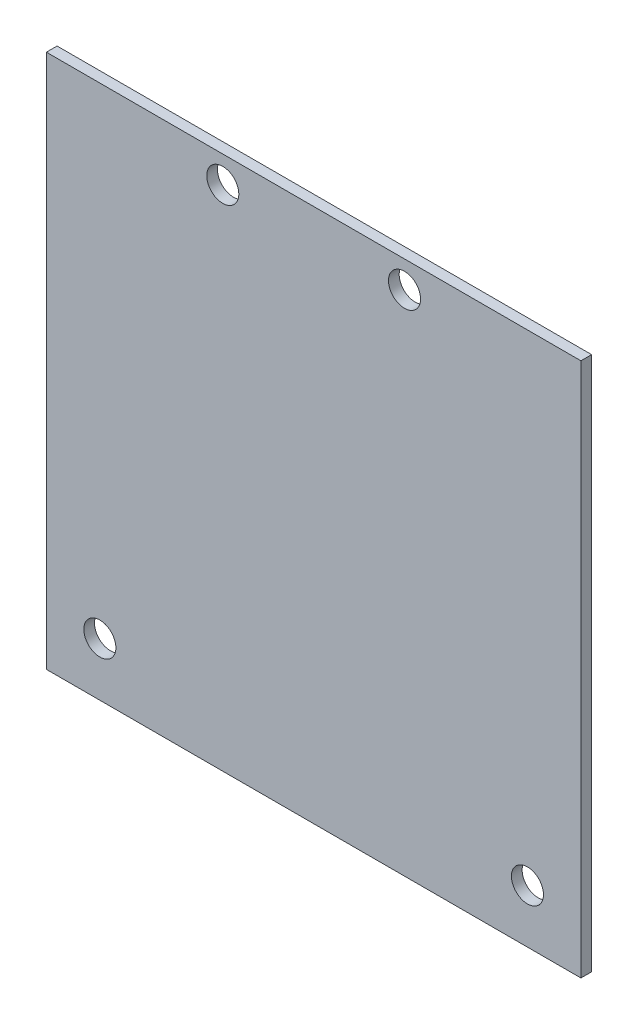
ISO-10303-21;
HEADER;
FILE_DESCRIPTION(('STEP AP214'),'2;1');
FILE_NAME('part.step','',(''),(''),'','','');
FILE_SCHEMA(('AUTOMOTIVE_DESIGN { 1 0 10303 214 1 1 1 1 }'));
ENDSEC;
DATA;
#1=APPLICATION_CONTEXT('core data for automotive mechanical design processes');
#2=APPLICATION_PROTOCOL_DEFINITION('international standard','automotive_design',2000,#1);
#3=PRODUCT_CONTEXT('',#1,'mechanical');
#4=PRODUCT('Part','Part','',(#3));
#5=PRODUCT_RELATED_PRODUCT_CATEGORY('part','',(#4));
#6=PRODUCT_DEFINITION_FORMATION('','',#4);
#7=PRODUCT_DEFINITION_CONTEXT('part definition',#1,'design');
#8=PRODUCT_DEFINITION('design','',#6,#7);
#9=PRODUCT_DEFINITION_SHAPE('','',#8);
#10=(LENGTH_UNIT() NAMED_UNIT(*) SI_UNIT(.MILLI.,.METRE.));
#11=(NAMED_UNIT(*) PLANE_ANGLE_UNIT() SI_UNIT($,.RADIAN.));
#12=(NAMED_UNIT(*) SI_UNIT($,.STERADIAN.) SOLID_ANGLE_UNIT());
#13=UNCERTAINTY_MEASURE_WITH_UNIT(LENGTH_MEASURE(1.E-05),#10,'distance_accuracy_value','');
#14=(GEOMETRIC_REPRESENTATION_CONTEXT(3) GLOBAL_UNCERTAINTY_ASSIGNED_CONTEXT((#13)) GLOBAL_UNIT_ASSIGNED_CONTEXT((#10,
#11,#12)) REPRESENTATION_CONTEXT('',''));
#15=CARTESIAN_POINT('',(0.,0.,0.));
#16=DIRECTION('',(0.,0.,1.));
#17=DIRECTION('',(1.,0.,0.));
#18=AXIS2_PLACEMENT_3D('',#15,#16,#17);
#19=CARTESIAN_POINT('',(0.,0.,1.));
#20=DIRECTION('',(0.,0.,-1.));
#21=DIRECTION('',(-1.,0.,0.));
#22=AXIS2_PLACEMENT_3D('',#19,#20,#21);
#23=PLANE('',#22);
#24=DIRECTION('',(0.,-1.,0.));
#25=VECTOR('',#24,1.);
#26=CARTESIAN_POINT('',(0.,0.,1.));
#27=LINE('',#26,#25);
#28=CARTESIAN_POINT('',(0.,50.,1.));
#29=VERTEX_POINT('',#28);
#30=CARTESIAN_POINT('',(0.,0.,1.));
#31=VERTEX_POINT('',#30);
#32=EDGE_CURVE('E84',#29,#31,#27,.T.);
#33=ORIENTED_EDGE('',*,*,#32,.T.);
#34=DIRECTION('',(1.,0.,0.));
#35=VECTOR('',#34,1.);
#36=CARTESIAN_POINT('',(0.,0.,1.));
#37=LINE('',#36,#35);
#38=CARTESIAN_POINT('',(50.,0.,1.));
#39=VERTEX_POINT('',#38);
#40=EDGE_CURVE('E79',#31,#39,#37,.T.);
#41=ORIENTED_EDGE('',*,*,#40,.T.);
#42=DIRECTION('',(0.,1.,0.));
#43=VECTOR('',#42,1.);
#44=CARTESIAN_POINT('',(50.,0.,1.));
#45=LINE('',#44,#43);
#46=CARTESIAN_POINT('',(50.,50.,1.));
#47=VERTEX_POINT('',#46);
#48=EDGE_CURVE('E82',#39,#47,#45,.T.);
#49=ORIENTED_EDGE('',*,*,#48,.T.);
#50=DIRECTION('',(-1.,0.,0.));
#51=VECTOR('',#50,1.);
#52=CARTESIAN_POINT('',(0.,50.,1.));
#53=LINE('',#52,#51);
#54=EDGE_CURVE('E49',#47,#29,#53,.T.);
#55=ORIENTED_EDGE('',*,*,#54,.T.);
#56=EDGE_LOOP('',(#33,#41,#49,#55));
#57=FACE_BOUND('',#56,.T.);
#58=CARTESIAN_POINT('',(16.5,47.5,1.));
#59=DIRECTION('',(0.,0.,1.));
#60=DIRECTION('',(1.,0.,0.));
#61=AXIS2_PLACEMENT_3D('',#58,#59,#60);
#62=CIRCLE('',#61,1.5);
#63=CARTESIAN_POINT('',(18.,47.5,1.));
#64=VERTEX_POINT('',#63);
#65=EDGE_CURVE('E99',#64,#64,#62,.T.);
#66=ORIENTED_EDGE('',*,*,#65,.F.);
#67=EDGE_LOOP('',(#66));
#68=FACE_BOUND('',#67,.T.);
#69=CARTESIAN_POINT('',(33.5,47.5,1.));
#70=DIRECTION('',(0.,0.,1.));
#71=DIRECTION('',(1.,0.,0.));
#72=AXIS2_PLACEMENT_3D('',#69,#70,#71);
#73=CIRCLE('',#72,1.5);
#74=CARTESIAN_POINT('',(35.,47.5,1.));
#75=VERTEX_POINT('',#74);
#76=EDGE_CURVE('E114',#75,#75,#73,.T.);
#77=ORIENTED_EDGE('',*,*,#76,.F.);
#78=EDGE_LOOP('',(#77));
#79=FACE_BOUND('',#78,.T.);
#80=CARTESIAN_POINT('',(5.,5.,1.));
#81=DIRECTION('',(0.,0.,1.));
#82=DIRECTION('',(1.,0.,0.));
#83=AXIS2_PLACEMENT_3D('',#80,#81,#82);
#84=CIRCLE('',#83,1.5);
#85=CARTESIAN_POINT('',(6.5,5.,1.));
#86=VERTEX_POINT('',#85);
#87=EDGE_CURVE('E120',#86,#86,#84,.T.);
#88=ORIENTED_EDGE('',*,*,#87,.F.);
#89=EDGE_LOOP('',(#88));
#90=FACE_BOUND('',#89,.T.);
#91=CARTESIAN_POINT('',(45.,5.,1.));
#92=DIRECTION('',(0.,0.,1.));
#93=DIRECTION('',(1.,0.,0.));
#94=AXIS2_PLACEMENT_3D('',#91,#92,#93);
#95=CIRCLE('',#94,1.5);
#96=CARTESIAN_POINT('',(46.5,5.,1.));
#97=VERTEX_POINT('',#96);
#98=EDGE_CURVE('E126',#97,#97,#95,.T.);
#99=ORIENTED_EDGE('',*,*,#98,.F.);
#100=EDGE_LOOP('',(#99));
#101=FACE_BOUND('',#100,.T.);
#102=ADVANCED_FACE('F32',(#57,#68,#79,#90,#101),#23,.F.);
#103=CARTESIAN_POINT('',(0.,0.,0.));
#104=DIRECTION('',(0.,0.,-1.));
#105=DIRECTION('',(-1.,0.,0.));
#106=AXIS2_PLACEMENT_3D('',#103,#104,#105);
#107=PLANE('',#106);
#108=CARTESIAN_POINT('',(5.,5.,0.));
#109=DIRECTION('',(0.,0.,1.));
#110=DIRECTION('',(1.,0.,0.));
#111=AXIS2_PLACEMENT_3D('',#108,#109,#110);
#112=CIRCLE('',#111,1.5);
#113=CARTESIAN_POINT('',(6.5,5.,0.));
#114=VERTEX_POINT('',#113);
#115=EDGE_CURVE('E123',#114,#114,#112,.T.);
#116=ORIENTED_EDGE('',*,*,#115,.T.);
#117=EDGE_LOOP('',(#116));
#118=FACE_BOUND('',#117,.T.);
#119=CARTESIAN_POINT('',(16.5,47.5,0.));
#120=DIRECTION('',(0.,0.,1.));
#121=DIRECTION('',(1.,0.,0.));
#122=AXIS2_PLACEMENT_3D('',#119,#120,#121);
#123=CIRCLE('',#122,1.5);
#124=CARTESIAN_POINT('',(18.,47.5,0.));
#125=VERTEX_POINT('',#124);
#126=EDGE_CURVE('E111',#125,#125,#123,.T.);
#127=ORIENTED_EDGE('',*,*,#126,.T.);
#128=EDGE_LOOP('',(#127));
#129=FACE_BOUND('',#128,.T.);
#130=DIRECTION('',(0.,-1.,0.));
#131=VECTOR('',#130,1.);
#132=CARTESIAN_POINT('',(0.,0.,0.));
#133=LINE('',#132,#131);
#134=CARTESIAN_POINT('',(0.,50.,0.));
#135=VERTEX_POINT('',#134);
#136=CARTESIAN_POINT('',(0.,0.,0.));
#137=VERTEX_POINT('',#136);
#138=EDGE_CURVE('E96',#135,#137,#133,.T.);
#139=ORIENTED_EDGE('',*,*,#138,.F.);
#140=DIRECTION('',(-1.,0.,0.));
#141=VECTOR('',#140,1.);
#142=CARTESIAN_POINT('',(0.,50.,0.));
#143=LINE('',#142,#141);
#144=CARTESIAN_POINT('',(50.,50.,0.));
#145=VERTEX_POINT('',#144);
#146=EDGE_CURVE('E72',#145,#135,#143,.T.);
#147=ORIENTED_EDGE('',*,*,#146,.F.);
#148=DIRECTION('',(0.,1.,0.));
#149=VECTOR('',#148,1.);
#150=CARTESIAN_POINT('',(50.,0.,0.));
#151=LINE('',#150,#149);
#152=CARTESIAN_POINT('',(50.,0.,0.));
#153=VERTEX_POINT('',#152);
#154=EDGE_CURVE('E66',#153,#145,#151,.T.);
#155=ORIENTED_EDGE('',*,*,#154,.F.);
#156=DIRECTION('',(1.,0.,0.));
#157=VECTOR('',#156,1.);
#158=CARTESIAN_POINT('',(0.,0.,0.));
#159=LINE('',#158,#157);
#160=EDGE_CURVE('E88',#137,#153,#159,.T.);
#161=ORIENTED_EDGE('',*,*,#160,.F.);
#162=EDGE_LOOP('',(#139,#147,#155,#161));
#163=FACE_BOUND('',#162,.T.);
#164=CARTESIAN_POINT('',(33.5,47.5,0.));
#165=DIRECTION('',(0.,0.,1.));
#166=DIRECTION('',(1.,0.,0.));
#167=AXIS2_PLACEMENT_3D('',#164,#165,#166);
#168=CIRCLE('',#167,1.5);
#169=CARTESIAN_POINT('',(35.,47.5,0.));
#170=VERTEX_POINT('',#169);
#171=EDGE_CURVE('E117',#170,#170,#168,.T.);
#172=ORIENTED_EDGE('',*,*,#171,.T.);
#173=EDGE_LOOP('',(#172));
#174=FACE_BOUND('',#173,.T.);
#175=CARTESIAN_POINT('',(45.,5.,0.));
#176=DIRECTION('',(0.,0.,1.));
#177=DIRECTION('',(1.,0.,0.));
#178=AXIS2_PLACEMENT_3D('',#175,#176,#177);
#179=CIRCLE('',#178,1.5);
#180=CARTESIAN_POINT('',(46.5,5.,0.));
#181=VERTEX_POINT('',#180);
#182=EDGE_CURVE('E129',#181,#181,#179,.T.);
#183=ORIENTED_EDGE('',*,*,#182,.T.);
#184=EDGE_LOOP('',(#183));
#185=FACE_BOUND('',#184,.T.);
#186=ADVANCED_FACE('F107',(#118,#129,#163,#174,#185),#107,.T.);
#187=CARTESIAN_POINT('',(0.,0.,1.));
#188=DIRECTION('',(1.,0.,0.));
#189=DIRECTION('',(0.,0.,-1.));
#190=AXIS2_PLACEMENT_3D('',#187,#188,#189);
#191=PLANE('',#190);
#192=ORIENTED_EDGE('',*,*,#138,.T.);
#193=DIRECTION('',(0.,0.,-1.));
#194=VECTOR('',#193,1.);
#195=CARTESIAN_POINT('',(0.,0.,1.));
#196=LINE('',#195,#194);
#197=EDGE_CURVE('E11',#31,#137,#196,.T.);
#198=ORIENTED_EDGE('',*,*,#197,.F.);
#199=ORIENTED_EDGE('',*,*,#32,.F.);
#200=DIRECTION('',(0.,0.,-1.));
#201=VECTOR('',#200,1.);
#202=CARTESIAN_POINT('',(0.,50.,1.));
#203=LINE('',#202,#201);
#204=EDGE_CURVE('E92',#29,#135,#203,.T.);
#205=ORIENTED_EDGE('',*,*,#204,.T.);
#206=EDGE_LOOP('',(#192,#198,#199,#205));
#207=FACE_BOUND('',#206,.T.);
#208=ADVANCED_FACE('F34',(#207),#191,.F.);
#209=CARTESIAN_POINT('',(0.,0.,1.));
#210=DIRECTION('',(0.,1.,0.));
#211=DIRECTION('',(0.,0.,1.));
#212=AXIS2_PLACEMENT_3D('',#209,#210,#211);
#213=PLANE('',#212);
#214=ORIENTED_EDGE('',*,*,#160,.T.);
#215=DIRECTION('',(0.,0.,-1.));
#216=VECTOR('',#215,1.);
#217=CARTESIAN_POINT('',(50.,0.,1.));
#218=LINE('',#217,#216);
#219=EDGE_CURVE('E41',#39,#153,#218,.T.);
#220=ORIENTED_EDGE('',*,*,#219,.F.);
#221=ORIENTED_EDGE('',*,*,#40,.F.);
#222=ORIENTED_EDGE('',*,*,#197,.T.);
#223=EDGE_LOOP('',(#214,#220,#221,#222));
#224=FACE_BOUND('',#223,.T.);
#225=ADVANCED_FACE('F87',(#224),#213,.F.);
#226=CARTESIAN_POINT('',(50.,0.,1.));
#227=DIRECTION('',(-1.,0.,0.));
#228=DIRECTION('',(0.,0.,1.));
#229=AXIS2_PLACEMENT_3D('',#226,#227,#228);
#230=PLANE('',#229);
#231=ORIENTED_EDGE('',*,*,#154,.T.);
#232=DIRECTION('',(0.,0.,-1.));
#233=VECTOR('',#232,1.);
#234=CARTESIAN_POINT('',(50.,50.,1.));
#235=LINE('',#234,#233);
#236=EDGE_CURVE('E89',#47,#145,#235,.T.);
#237=ORIENTED_EDGE('',*,*,#236,.F.);
#238=ORIENTED_EDGE('',*,*,#48,.F.);
#239=ORIENTED_EDGE('',*,*,#219,.T.);
#240=EDGE_LOOP('',(#231,#237,#238,#239));
#241=FACE_BOUND('',#240,.T.);
#242=ADVANCED_FACE('F90',(#241),#230,.F.);
#243=CARTESIAN_POINT('',(0.,50.,1.));
#244=DIRECTION('',(0.,-1.,0.));
#245=DIRECTION('',(0.,0.,-1.));
#246=AXIS2_PLACEMENT_3D('',#243,#244,#245);
#247=PLANE('',#246);
#248=ORIENTED_EDGE('',*,*,#146,.T.);
#249=ORIENTED_EDGE('',*,*,#204,.F.);
#250=ORIENTED_EDGE('',*,*,#54,.F.);
#251=ORIENTED_EDGE('',*,*,#236,.T.);
#252=EDGE_LOOP('',(#248,#249,#250,#251));
#253=FACE_BOUND('',#252,.T.);
#254=ADVANCED_FACE('F104',(#253),#247,.F.);
#255=CARTESIAN_POINT('',(16.5,47.5,1.));
#256=DIRECTION('',(0.,0.,-1.));
#257=DIRECTION('',(-1.,0.,0.));
#258=AXIS2_PLACEMENT_3D('',#255,#256,#257);
#259=CYLINDRICAL_SURFACE('',#258,1.5);
#260=ORIENTED_EDGE('',*,*,#65,.T.);
#261=EDGE_LOOP('',(#260));
#262=FACE_BOUND('',#261,.T.);
#263=ORIENTED_EDGE('',*,*,#126,.F.);
#264=EDGE_LOOP('',(#263));
#265=FACE_BOUND('',#264,.T.);
#266=ADVANCED_FACE('F146',(#262,#265),#259,.F.);
#267=CARTESIAN_POINT('',(33.5,47.5,1.));
#268=DIRECTION('',(0.,0.,-1.));
#269=DIRECTION('',(-1.,0.,0.));
#270=AXIS2_PLACEMENT_3D('',#267,#268,#269);
#271=CYLINDRICAL_SURFACE('',#270,1.5);
#272=ORIENTED_EDGE('',*,*,#76,.T.);
#273=EDGE_LOOP('',(#272));
#274=FACE_BOUND('',#273,.T.);
#275=ORIENTED_EDGE('',*,*,#171,.F.);
#276=EDGE_LOOP('',(#275));
#277=FACE_BOUND('',#276,.T.);
#278=ADVANCED_FACE('F192',(#274,#277),#271,.F.);
#279=CARTESIAN_POINT('',(5.,5.,1.));
#280=DIRECTION('',(0.,0.,-1.));
#281=DIRECTION('',(-1.,0.,0.));
#282=AXIS2_PLACEMENT_3D('',#279,#280,#281);
#283=CYLINDRICAL_SURFACE('',#282,1.5);
#284=ORIENTED_EDGE('',*,*,#87,.T.);
#285=EDGE_LOOP('',(#284));
#286=FACE_BOUND('',#285,.T.);
#287=ORIENTED_EDGE('',*,*,#115,.F.);
#288=EDGE_LOOP('',(#287));
#289=FACE_BOUND('',#288,.T.);
#290=ADVANCED_FACE('F200',(#286,#289),#283,.F.);
#291=CARTESIAN_POINT('',(45.,5.,1.));
#292=DIRECTION('',(0.,0.,-1.));
#293=DIRECTION('',(-1.,0.,0.));
#294=AXIS2_PLACEMENT_3D('',#291,#292,#293);
#295=CYLINDRICAL_SURFACE('',#294,1.5);
#296=ORIENTED_EDGE('',*,*,#98,.T.);
#297=EDGE_LOOP('',(#296));
#298=FACE_BOUND('',#297,.T.);
#299=ORIENTED_EDGE('',*,*,#182,.F.);
#300=EDGE_LOOP('',(#299));
#301=FACE_BOUND('',#300,.T.);
#302=ADVANCED_FACE('F135',(#298,#301),#295,.F.);
#303=CLOSED_SHELL('',(#102,#186,#208,#225,#242,#254,#266,#278,#290,#302));
#304=MANIFOLD_SOLID_BREP('B2',#303);
#305=ADVANCED_BREP_SHAPE_REPRESENTATION('',(#18,#304),#14);
#306=SHAPE_DEFINITION_REPRESENTATION(#9,#305);
ENDSEC;
END-ISO-10303-21;
